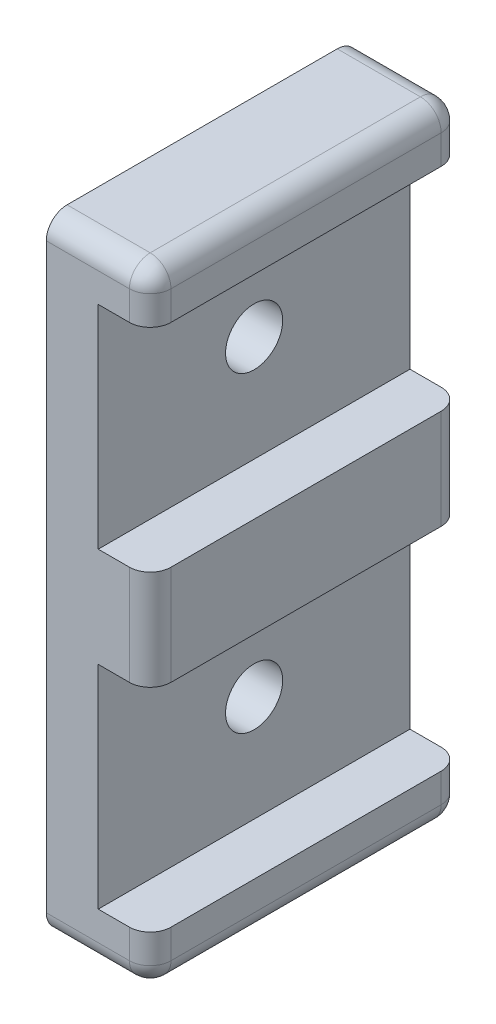
ISO-10303-21;
HEADER;
FILE_DESCRIPTION(('STEP AP214'),'2;1');
FILE_NAME('part.step','',(''),(''),'','','');
FILE_SCHEMA(('AUTOMOTIVE_DESIGN { 1 0 10303 214 1 1 1 1 }'));
ENDSEC;
DATA;
#1=APPLICATION_CONTEXT('core data for automotive mechanical design processes');
#2=APPLICATION_PROTOCOL_DEFINITION('international standard','automotive_design',2000,#1);
#3=PRODUCT_CONTEXT('',#1,'mechanical');
#4=PRODUCT('Part','Part','',(#3));
#5=PRODUCT_RELATED_PRODUCT_CATEGORY('part','',(#4));
#6=PRODUCT_DEFINITION_FORMATION('','',#4);
#7=PRODUCT_DEFINITION_CONTEXT('part definition',#1,'design');
#8=PRODUCT_DEFINITION('design','',#6,#7);
#9=PRODUCT_DEFINITION_SHAPE('','',#8);
#10=(LENGTH_UNIT() NAMED_UNIT(*) SI_UNIT(.MILLI.,.METRE.));
#11=(NAMED_UNIT(*) PLANE_ANGLE_UNIT() SI_UNIT($,.RADIAN.));
#12=(NAMED_UNIT(*) SI_UNIT($,.STERADIAN.) SOLID_ANGLE_UNIT());
#13=UNCERTAINTY_MEASURE_WITH_UNIT(LENGTH_MEASURE(1.E-05),#10,'distance_accuracy_value','');
#14=(GEOMETRIC_REPRESENTATION_CONTEXT(3) GLOBAL_UNCERTAINTY_ASSIGNED_CONTEXT((#13)) GLOBAL_UNIT_ASSIGNED_CONTEXT((#10,
#11,#12)) REPRESENTATION_CONTEXT('',''));
#15=CARTESIAN_POINT('',(0.,0.,0.));
#16=DIRECTION('',(0.,0.,1.));
#17=DIRECTION('',(1.,0.,0.));
#18=AXIS2_PLACEMENT_3D('',#15,#16,#17);
#19=CARTESIAN_POINT('',(0.,-28.0000000000014,12.9999999999988));
#20=DIRECTION('',(1.,0.,0.));
#21=DIRECTION('',(0.,0.,-1.));
#22=AXIS2_PLACEMENT_3D('',#19,#20,#21);
#23=PLANE('',#22);
#24=CARTESIAN_POINT('',(0.,14.9999999999986,-8.74300631892311E-13));
#25=DIRECTION('',(1.,0.,0.));
#26=DIRECTION('',(0.,0.,-1.));
#27=AXIS2_PLACEMENT_3D('',#24,#25,#26);
#28=CIRCLE('',#27,2.75);
#29=CARTESIAN_POINT('',(0.,14.9999999999986,-2.75000000000087));
#30=VERTEX_POINT('',#29);
#31=EDGE_CURVE('E217',#30,#30,#28,.T.);
#32=ORIENTED_EDGE('',*,*,#31,.F.);
#33=EDGE_LOOP('',(#32));
#34=FACE_BOUND('',#33,.T.);
#35=DIRECTION('',(0.,-1.,0.));
#36=VECTOR('',#35,1.);
#37=CARTESIAN_POINT('',(0.,27.9999999999987,14.9999999999988));
#38=LINE('',#37,#36);
#39=CARTESIAN_POINT('',(0.,25.2,14.9999999999988));
#40=VERTEX_POINT('',#39);
#41=CARTESIAN_POINT('',(0.,4.80000000000012,14.999999999999));
#42=VERTEX_POINT('',#41);
#43=EDGE_CURVE('E203',#40,#42,#38,.T.);
#44=ORIENTED_EDGE('',*,*,#43,.T.);
#45=DIRECTION('',(0.,0.,1.));
#46=VECTOR('',#45,1.);
#47=CARTESIAN_POINT('',(0.,4.80000000000012,0.));
#48=LINE('',#47,#46);
#49=CARTESIAN_POINT('',(0.,4.80000000000012,-15.0000000000007));
#50=VERTEX_POINT('',#49);
#51=EDGE_CURVE('E188',#50,#42,#48,.T.);
#52=ORIENTED_EDGE('',*,*,#51,.F.);
#53=DIRECTION('',(0.,1.,0.));
#54=VECTOR('',#53,1.);
#55=CARTESIAN_POINT('',(0.,-28.0000000000014,-15.0000000000006));
#56=LINE('',#55,#54);
#57=CARTESIAN_POINT('',(0.,25.2,-15.0000000000008));
#58=VERTEX_POINT('',#57);
#59=EDGE_CURVE('E200',#50,#58,#56,.T.);
#60=ORIENTED_EDGE('',*,*,#59,.T.);
#61=DIRECTION('',(0.,0.,-1.));
#62=VECTOR('',#61,1.);
#63=CARTESIAN_POINT('',(0.,25.2,0.));
#64=LINE('',#63,#62);
#65=EDGE_CURVE('E194',#40,#58,#64,.T.);
#66=ORIENTED_EDGE('',*,*,#65,.F.);
#67=EDGE_LOOP('',(#44,#52,#60,#66));
#68=FACE_BOUND('',#67,.T.);
#69=ADVANCED_FACE('F32',(#34,#68),#23,.T.);
#70=CARTESIAN_POINT('',(0.,-14.9999999999986,-8.70677814856241E-13));
#71=DIRECTION('',(1.,0.,0.));
#72=DIRECTION('',(0.,0.,-1.));
#73=AXIS2_PLACEMENT_3D('',#70,#71,#72);
#74=CIRCLE('',#73,2.75);
#75=CARTESIAN_POINT('',(0.,-14.9999999999986,-2.75000000000087));
#76=VERTEX_POINT('',#75);
#77=EDGE_CURVE('E352',#76,#76,#74,.T.);
#78=ORIENTED_EDGE('',*,*,#77,.F.);
#79=EDGE_LOOP('',(#78));
#80=FACE_BOUND('',#79,.T.);
#81=CARTESIAN_POINT('',(0.,-4.79999999999988,14.999999999999));
#82=VERTEX_POINT('',#81);
#83=CARTESIAN_POINT('',(0.,-25.1999999999999,14.9999999999991));
#84=VERTEX_POINT('',#83);
#85=EDGE_CURVE('E215',#82,#84,#38,.T.);
#86=ORIENTED_EDGE('',*,*,#85,.T.);
#87=DIRECTION('',(0.,0.,1.));
#88=VECTOR('',#87,1.);
#89=CARTESIAN_POINT('',(0.,-25.1999999999999,0.));
#90=LINE('',#89,#88);
#91=CARTESIAN_POINT('',(0.,-25.1999999999999,-15.0000000000006));
#92=VERTEX_POINT('',#91);
#93=EDGE_CURVE('E314',#92,#84,#90,.T.);
#94=ORIENTED_EDGE('',*,*,#93,.F.);
#95=CARTESIAN_POINT('',(0.,-4.79999999999989,-15.0000000000007));
#96=VERTEX_POINT('',#95);
#97=EDGE_CURVE('E211',#92,#96,#56,.T.);
#98=ORIENTED_EDGE('',*,*,#97,.T.);
#99=DIRECTION('',(0.,0.,-1.));
#100=VECTOR('',#99,1.);
#101=CARTESIAN_POINT('',(0.,-4.79999999999989,0.));
#102=LINE('',#101,#100);
#103=EDGE_CURVE('E204',#82,#96,#102,.T.);
#104=ORIENTED_EDGE('',*,*,#103,.F.);
#105=EDGE_LOOP('',(#86,#94,#98,#104));
#106=FACE_BOUND('',#105,.T.);
#107=ADVANCED_FACE('F437',(#80,#106),#23,.T.);
#108=CARTESIAN_POINT('',(-5.,-28.0000000000014,12.9999999999988));
#109=DIRECTION('',(1.,0.,0.));
#110=DIRECTION('',(0.,0.,-1.));
#111=AXIS2_PLACEMENT_3D('',#108,#109,#110);
#112=CYLINDRICAL_SURFACE('',#111,2.00000000000032);
#113=DIRECTION('',(1.,0.,0.));
#114=VECTOR('',#113,1.);
#115=CARTESIAN_POINT('',(-5.,-30.0000000000017,12.9999999999991));
#116=LINE('',#115,#114);
#117=CARTESIAN_POINT('',(-5.,-30.0000000000017,12.9999999999991));
#118=VERTEX_POINT('',#117);
#119=CARTESIAN_POINT('',(3.,-30.0000000000017,12.9999999999991));
#120=VERTEX_POINT('',#119);
#121=EDGE_CURVE('E246',#118,#120,#116,.T.);
#122=ORIENTED_EDGE('',*,*,#121,.T.);
#123=CARTESIAN_POINT('',(3.,-28.0000000000014,12.9999999999988));
#124=DIRECTION('',(1.,0.,0.));
#125=DIRECTION('',(0.,0.,-1.));
#126=AXIS2_PLACEMENT_3D('',#123,#124,#125);
#127=CIRCLE('',#126,2.00000000000032);
#128=CARTESIAN_POINT('',(3.,-28.0000000000014,14.9999999999991));
#129=VERTEX_POINT('',#128);
#130=EDGE_CURVE('E265',#120,#129,#127,.F.);
#131=ORIENTED_EDGE('',*,*,#130,.T.);
#132=DIRECTION('',(1.,0.,0.));
#133=VECTOR('',#132,1.);
#134=CARTESIAN_POINT('',(-5.,-28.0000000000014,14.9999999999991));
#135=LINE('',#134,#133);
#136=CARTESIAN_POINT('',(-5.,-28.0000000000014,14.9999999999991));
#137=VERTEX_POINT('',#136);
#138=EDGE_CURVE('E225',#137,#129,#135,.T.);
#139=ORIENTED_EDGE('',*,*,#138,.F.);
#140=CARTESIAN_POINT('',(-5.,-28.0000000000014,12.9999999999988));
#141=DIRECTION('',(1.,0.,0.));
#142=DIRECTION('',(0.,0.,-1.));
#143=AXIS2_PLACEMENT_3D('',#140,#141,#142);
#144=CIRCLE('',#143,2.00000000000032);
#145=EDGE_CURVE('E224',#137,#118,#144,.T.);
#146=ORIENTED_EDGE('',*,*,#145,.T.);
#147=EDGE_LOOP('',(#122,#131,#139,#146));
#148=FACE_BOUND('',#147,.T.);
#149=ADVANCED_FACE('F392',(#148),#112,.T.);
#150=CARTESIAN_POINT('',(-5.,27.9999999999987,14.9999999999988));
#151=DIRECTION('',(0.,0.,1.));
#152=DIRECTION('',(0.,-1.,0.));
#153=AXIS2_PLACEMENT_3D('',#150,#151,#152);
#154=PLANE('',#153);
#155=ORIENTED_EDGE('',*,*,#138,.T.);
#156=DIRECTION('',(0.,-1.,0.));
#157=VECTOR('',#156,1.);
#158=CARTESIAN_POINT('',(3.,27.9999999999987,14.9999999999988));
#159=LINE('',#158,#157);
#160=CARTESIAN_POINT('',(3.,-25.1999999999999,14.9999999999991));
#161=VERTEX_POINT('',#160);
#162=EDGE_CURVE('E259',#129,#161,#159,.F.);
#163=ORIENTED_EDGE('',*,*,#162,.T.);
#164=DIRECTION('',(-1.,0.,0.));
#165=VECTOR('',#164,1.);
#166=CARTESIAN_POINT('',(5.,-25.1999999999999,14.9999999999991));
#167=LINE('',#166,#165);
#168=EDGE_CURVE('E405',#161,#84,#167,.T.);
#169=ORIENTED_EDGE('',*,*,#168,.T.);
#170=ORIENTED_EDGE('',*,*,#85,.F.);
#171=DIRECTION('',(-1.,0.,0.));
#172=VECTOR('',#171,1.);
#173=CARTESIAN_POINT('',(5.,-4.79999999999989,14.999999999999));
#174=LINE('',#173,#172);
#175=CARTESIAN_POINT('',(3.,-4.79999999999989,14.999999999999));
#176=VERTEX_POINT('',#175);
#177=EDGE_CURVE('E428',#176,#82,#174,.T.);
#178=ORIENTED_EDGE('',*,*,#177,.F.);
#179=DIRECTION('',(0.,-1.,0.));
#180=VECTOR('',#179,1.);
#181=CARTESIAN_POINT('',(3.,27.9999999999987,14.9999999999988));
#182=LINE('',#181,#180);
#183=CARTESIAN_POINT('',(3.,4.80000000000012,14.999999999999));
#184=VERTEX_POINT('',#183);
#185=EDGE_CURVE('E257',#176,#184,#182,.F.);
#186=ORIENTED_EDGE('',*,*,#185,.T.);
#187=DIRECTION('',(-1.,0.,0.));
#188=VECTOR('',#187,1.);
#189=CARTESIAN_POINT('',(5.,4.80000000000012,14.999999999999));
#190=LINE('',#189,#188);
#191=EDGE_CURVE('E195',#184,#42,#190,.T.);
#192=ORIENTED_EDGE('',*,*,#191,.T.);
#193=ORIENTED_EDGE('',*,*,#43,.F.);
#194=DIRECTION('',(-1.,0.,0.));
#195=VECTOR('',#194,1.);
#196=CARTESIAN_POINT('',(5.,25.2,14.9999999999988));
#197=LINE('',#196,#195);
#198=CARTESIAN_POINT('',(3.,25.2,14.9999999999988));
#199=VERTEX_POINT('',#198);
#200=EDGE_CURVE('E346',#199,#40,#197,.T.);
#201=ORIENTED_EDGE('',*,*,#200,.F.);
#202=DIRECTION('',(0.,-1.,0.));
#203=VECTOR('',#202,1.);
#204=CARTESIAN_POINT('',(3.,27.9999999999987,14.9999999999988));
#205=LINE('',#204,#203);
#206=CARTESIAN_POINT('',(3.,27.9999999999987,14.9999999999988));
#207=VERTEX_POINT('',#206);
#208=EDGE_CURVE('E255',#199,#207,#205,.F.);
#209=ORIENTED_EDGE('',*,*,#208,.T.);
#210=DIRECTION('',(1.,0.,0.));
#211=VECTOR('',#210,1.);
#212=CARTESIAN_POINT('',(-5.,27.9999999999987,14.9999999999988));
#213=LINE('',#212,#211);
#214=CARTESIAN_POINT('',(-5.,27.9999999999987,14.9999999999988));
#215=VERTEX_POINT('',#214);
#216=EDGE_CURVE('E229',#215,#207,#213,.T.);
#217=ORIENTED_EDGE('',*,*,#216,.F.);
#218=DIRECTION('',(0.,-1.,0.));
#219=VECTOR('',#218,1.);
#220=CARTESIAN_POINT('',(-5.,27.9999999999987,14.9999999999988));
#221=LINE('',#220,#219);
#222=EDGE_CURVE('E221',#215,#137,#221,.T.);
#223=ORIENTED_EDGE('',*,*,#222,.T.);
#224=EDGE_LOOP('',(#155,#163,#169,#170,#178,#186,#192,#193,#201,#209,#217,#223));
#225=FACE_BOUND('',#224,.T.);
#226=ADVANCED_FACE('F383',(#225),#154,.T.);
#227=CARTESIAN_POINT('',(-5.,27.9999999999987,12.9999999999988));
#228=DIRECTION('',(1.,0.,0.));
#229=DIRECTION('',(0.,0.,-1.));
#230=AXIS2_PLACEMENT_3D('',#227,#228,#229);
#231=CYLINDRICAL_SURFACE('',#230,2.00000000000002);
#232=ORIENTED_EDGE('',*,*,#216,.T.);
#233=CARTESIAN_POINT('',(3.,27.9999999999987,12.9999999999988));
#234=DIRECTION('',(1.,0.,0.));
#235=DIRECTION('',(0.,0.,-1.));
#236=AXIS2_PLACEMENT_3D('',#233,#234,#235);
#237=CIRCLE('',#236,2.00000000000002);
#238=CARTESIAN_POINT('',(3.,29.9999999999987,12.9999999999991));
#239=VERTEX_POINT('',#238);
#240=EDGE_CURVE('E292',#207,#239,#237,.F.);
#241=ORIENTED_EDGE('',*,*,#240,.T.);
#242=DIRECTION('',(1.,0.,0.));
#243=VECTOR('',#242,1.);
#244=CARTESIAN_POINT('',(-5.,29.9999999999987,12.9999999999991));
#245=LINE('',#244,#243);
#246=CARTESIAN_POINT('',(-5.,29.9999999999987,12.9999999999991));
#247=VERTEX_POINT('',#246);
#248=EDGE_CURVE('E232',#247,#239,#245,.T.);
#249=ORIENTED_EDGE('',*,*,#248,.F.);
#250=CARTESIAN_POINT('',(-5.,27.9999999999987,12.9999999999988));
#251=DIRECTION('',(1.,0.,0.));
#252=DIRECTION('',(0.,0.,-1.));
#253=AXIS2_PLACEMENT_3D('',#250,#251,#252);
#254=CIRCLE('',#253,2.00000000000002);
#255=EDGE_CURVE('E376',#247,#215,#254,.T.);
#256=ORIENTED_EDGE('',*,*,#255,.T.);
#257=EDGE_LOOP('',(#232,#241,#249,#256));
#258=FACE_BOUND('',#257,.T.);
#259=ADVANCED_FACE('F464',(#258),#231,.T.);
#260=CARTESIAN_POINT('',(-5.,29.999999999999,-13.0000000000009));
#261=DIRECTION('',(0.,1.,0.));
#262=DIRECTION('',(0.,0.,1.));
#263=AXIS2_PLACEMENT_3D('',#260,#261,#262);
#264=PLANE('',#263);
#265=ORIENTED_EDGE('',*,*,#248,.T.);
#266=DIRECTION('',(0.,0.,1.));
#267=VECTOR('',#266,1.);
#268=CARTESIAN_POINT('',(3.,29.999999999999,-13.0000000000009));
#269=LINE('',#268,#267);
#270=CARTESIAN_POINT('',(3.,29.999999999999,-13.0000000000009));
#271=VERTEX_POINT('',#270);
#272=EDGE_CURVE('E290',#239,#271,#269,.F.);
#273=ORIENTED_EDGE('',*,*,#272,.T.);
#274=DIRECTION('',(1.,0.,0.));
#275=VECTOR('',#274,1.);
#276=CARTESIAN_POINT('',(-5.,29.999999999999,-13.0000000000009));
#277=LINE('',#276,#275);
#278=CARTESIAN_POINT('',(-5.,29.999999999999,-13.0000000000009));
#279=VERTEX_POINT('',#278);
#280=EDGE_CURVE('E235',#279,#271,#277,.T.);
#281=ORIENTED_EDGE('',*,*,#280,.F.);
#282=DIRECTION('',(0.,0.,1.));
#283=VECTOR('',#282,1.);
#284=CARTESIAN_POINT('',(-5.,29.999999999999,-13.0000000000009));
#285=LINE('',#284,#283);
#286=EDGE_CURVE('E374',#279,#247,#285,.T.);
#287=ORIENTED_EDGE('',*,*,#286,.T.);
#288=EDGE_LOOP('',(#265,#273,#281,#287));
#289=FACE_BOUND('',#288,.T.);
#290=ADVANCED_FACE('F467',(#289),#264,.T.);
#291=CARTESIAN_POINT('',(-5.,27.9999999999987,-13.0000000000006));
#292=DIRECTION('',(1.,0.,0.));
#293=DIRECTION('',(0.,0.,-1.));
#294=AXIS2_PLACEMENT_3D('',#291,#292,#293);
#295=CYLINDRICAL_SURFACE('',#294,2.00000000000027);
#296=ORIENTED_EDGE('',*,*,#280,.T.);
#297=CARTESIAN_POINT('',(3.,27.9999999999987,-13.0000000000006));
#298=DIRECTION('',(1.,0.,0.));
#299=DIRECTION('',(0.,0.,-1.));
#300=AXIS2_PLACEMENT_3D('',#297,#298,#299);
#301=CIRCLE('',#300,2.00000000000027);
#302=CARTESIAN_POINT('',(3.,27.9999999999987,-15.0000000000008));
#303=VERTEX_POINT('',#302);
#304=EDGE_CURVE('E288',#271,#303,#301,.F.);
#305=ORIENTED_EDGE('',*,*,#304,.T.);
#306=DIRECTION('',(1.,0.,0.));
#307=VECTOR('',#306,1.);
#308=CARTESIAN_POINT('',(-5.,27.9999999999987,-15.0000000000008));
#309=LINE('',#308,#307);
#310=CARTESIAN_POINT('',(-5.,27.9999999999987,-15.0000000000008));
#311=VERTEX_POINT('',#310);
#312=EDGE_CURVE('E238',#311,#303,#309,.T.);
#313=ORIENTED_EDGE('',*,*,#312,.F.);
#314=CARTESIAN_POINT('',(-5.,27.9999999999987,-13.0000000000006));
#315=DIRECTION('',(1.,0.,0.));
#316=DIRECTION('',(0.,0.,-1.));
#317=AXIS2_PLACEMENT_3D('',#314,#315,#316);
#318=CIRCLE('',#317,2.00000000000027);
#319=EDGE_CURVE('E371',#311,#279,#318,.T.);
#320=ORIENTED_EDGE('',*,*,#319,.T.);
#321=EDGE_LOOP('',(#296,#305,#313,#320));
#322=FACE_BOUND('',#321,.T.);
#323=ADVANCED_FACE('F470',(#322),#295,.T.);
#324=CARTESIAN_POINT('',(-5.,-28.0000000000014,-15.0000000000006));
#325=DIRECTION('',(0.,0.,-1.));
#326=DIRECTION('',(0.,1.,0.));
#327=AXIS2_PLACEMENT_3D('',#324,#325,#326);
#328=PLANE('',#327);
#329=ORIENTED_EDGE('',*,*,#312,.T.);
#330=DIRECTION('',(0.,1.,0.));
#331=VECTOR('',#330,1.);
#332=CARTESIAN_POINT('',(3.,-28.0000000000014,-15.0000000000006));
#333=LINE('',#332,#331);
#334=CARTESIAN_POINT('',(3.,25.2,-15.0000000000008));
#335=VERTEX_POINT('',#334);
#336=EDGE_CURVE('E282',#303,#335,#333,.F.);
#337=ORIENTED_EDGE('',*,*,#336,.T.);
#338=DIRECTION('',(-1.,0.,0.));
#339=VECTOR('',#338,1.);
#340=CARTESIAN_POINT('',(5.,25.2,-15.0000000000008));
#341=LINE('',#340,#339);
#342=EDGE_CURVE('E210',#335,#58,#341,.T.);
#343=ORIENTED_EDGE('',*,*,#342,.T.);
#344=ORIENTED_EDGE('',*,*,#59,.F.);
#345=DIRECTION('',(-1.,0.,0.));
#346=VECTOR('',#345,1.);
#347=CARTESIAN_POINT('',(5.,4.80000000000012,-15.0000000000007));
#348=LINE('',#347,#346);
#349=CARTESIAN_POINT('',(3.,4.80000000000012,-15.0000000000007));
#350=VERTEX_POINT('',#349);
#351=EDGE_CURVE('E183',#350,#50,#348,.T.);
#352=ORIENTED_EDGE('',*,*,#351,.F.);
#353=DIRECTION('',(0.,1.,0.));
#354=VECTOR('',#353,1.);
#355=CARTESIAN_POINT('',(3.,-28.0000000000014,-15.0000000000006));
#356=LINE('',#355,#354);
#357=CARTESIAN_POINT('',(3.,-4.79999999999989,-15.0000000000007));
#358=VERTEX_POINT('',#357);
#359=EDGE_CURVE('E278',#350,#358,#356,.F.);
#360=ORIENTED_EDGE('',*,*,#359,.T.);
#361=DIRECTION('',(-1.,0.,0.));
#362=VECTOR('',#361,1.);
#363=CARTESIAN_POINT('',(5.,-4.79999999999989,-15.0000000000007));
#364=LINE('',#363,#362);
#365=EDGE_CURVE('E423',#358,#96,#364,.T.);
#366=ORIENTED_EDGE('',*,*,#365,.T.);
#367=ORIENTED_EDGE('',*,*,#97,.F.);
#368=DIRECTION('',(-1.,0.,0.));
#369=VECTOR('',#368,1.);
#370=CARTESIAN_POINT('',(5.,-25.1999999999999,-15.0000000000006));
#371=LINE('',#370,#369);
#372=CARTESIAN_POINT('',(3.,-25.1999999999999,-15.0000000000006));
#373=VERTEX_POINT('',#372);
#374=EDGE_CURVE('E205',#373,#92,#371,.T.);
#375=ORIENTED_EDGE('',*,*,#374,.F.);
#376=DIRECTION('',(0.,1.,0.));
#377=VECTOR('',#376,1.);
#378=CARTESIAN_POINT('',(3.,-28.0000000000014,-15.0000000000006));
#379=LINE('',#378,#377);
#380=CARTESIAN_POINT('',(3.,-28.0000000000014,-15.0000000000006));
#381=VERTEX_POINT('',#380);
#382=EDGE_CURVE('E280',#373,#381,#379,.F.);
#383=ORIENTED_EDGE('',*,*,#382,.T.);
#384=DIRECTION('',(1.,0.,0.));
#385=VECTOR('',#384,1.);
#386=CARTESIAN_POINT('',(-5.,-28.0000000000014,-15.0000000000006));
#387=LINE('',#386,#385);
#388=CARTESIAN_POINT('',(-5.,-28.0000000000014,-15.0000000000006));
#389=VERTEX_POINT('',#388);
#390=EDGE_CURVE('E240',#389,#381,#387,.T.);
#391=ORIENTED_EDGE('',*,*,#390,.F.);
#392=DIRECTION('',(0.,1.,0.));
#393=VECTOR('',#392,1.);
#394=CARTESIAN_POINT('',(-5.,-28.0000000000014,-15.0000000000006));
#395=LINE('',#394,#393);
#396=EDGE_CURVE('E368',#389,#311,#395,.T.);
#397=ORIENTED_EDGE('',*,*,#396,.T.);
#398=EDGE_LOOP('',(#329,#337,#343,#344,#352,#360,#366,#367,#375,#383,#391,#397));
#399=FACE_BOUND('',#398,.T.);
#400=ADVANCED_FACE('F208',(#399),#328,.T.);
#401=CARTESIAN_POINT('',(-5.,-28.0000000000014,-13.0000000000006));
#402=DIRECTION('',(1.,0.,0.));
#403=DIRECTION('',(0.,0.,-1.));
#404=AXIS2_PLACEMENT_3D('',#401,#402,#403);
#405=CYLINDRICAL_SURFACE('',#404,2.00000000000002);
#406=ORIENTED_EDGE('',*,*,#390,.T.);
#407=CARTESIAN_POINT('',(3.,-28.0000000000014,-13.0000000000006));
#408=DIRECTION('',(1.,0.,0.));
#409=DIRECTION('',(0.,0.,-1.));
#410=AXIS2_PLACEMENT_3D('',#407,#408,#409);
#411=CIRCLE('',#410,2.00000000000002);
#412=CARTESIAN_POINT('',(3.,-30.0000000000014,-13.0000000000009));
#413=VERTEX_POINT('',#412);
#414=EDGE_CURVE('E269',#381,#413,#411,.F.);
#415=ORIENTED_EDGE('',*,*,#414,.T.);
#416=DIRECTION('',(1.,0.,0.));
#417=VECTOR('',#416,1.);
#418=CARTESIAN_POINT('',(-5.,-30.0000000000014,-13.0000000000009));
#419=LINE('',#418,#417);
#420=CARTESIAN_POINT('',(-5.,-30.0000000000014,-13.0000000000009));
#421=VERTEX_POINT('',#420);
#422=EDGE_CURVE('E243',#421,#413,#419,.T.);
#423=ORIENTED_EDGE('',*,*,#422,.F.);
#424=CARTESIAN_POINT('',(-5.,-28.0000000000014,-13.0000000000006));
#425=DIRECTION('',(1.,0.,0.));
#426=DIRECTION('',(0.,0.,-1.));
#427=AXIS2_PLACEMENT_3D('',#424,#425,#426);
#428=CIRCLE('',#427,2.00000000000002);
#429=EDGE_CURVE('E365',#421,#389,#428,.T.);
#430=ORIENTED_EDGE('',*,*,#429,.T.);
#431=EDGE_LOOP('',(#406,#415,#423,#430));
#432=FACE_BOUND('',#431,.T.);
#433=ADVANCED_FACE('F477',(#432),#405,.T.);
#434=CARTESIAN_POINT('',(-5.,-30.0000000000017,12.9999999999991));
#435=DIRECTION('',(0.,-1.,0.));
#436=DIRECTION('',(0.,0.,-1.));
#437=AXIS2_PLACEMENT_3D('',#434,#435,#436);
#438=PLANE('',#437);
#439=ORIENTED_EDGE('',*,*,#422,.T.);
#440=DIRECTION('',(0.,0.,-1.));
#441=VECTOR('',#440,1.);
#442=CARTESIAN_POINT('',(3.,-30.0000000000017,12.9999999999991));
#443=LINE('',#442,#441);
#444=EDGE_CURVE('E267',#413,#120,#443,.F.);
#445=ORIENTED_EDGE('',*,*,#444,.T.);
#446=ORIENTED_EDGE('',*,*,#121,.F.);
#447=DIRECTION('',(0.,0.,-1.));
#448=VECTOR('',#447,1.);
#449=CARTESIAN_POINT('',(-5.,-30.0000000000017,12.9999999999991));
#450=LINE('',#449,#448);
#451=EDGE_CURVE('E362',#118,#421,#450,.T.);
#452=ORIENTED_EDGE('',*,*,#451,.T.);
#453=EDGE_LOOP('',(#439,#445,#446,#452));
#454=FACE_BOUND('',#453,.T.);
#455=ADVANCED_FACE('F480',(#454),#438,.T.);
#456=CARTESIAN_POINT('',(-5.,-28.0000000000014,12.9999999999988));
#457=DIRECTION('',(1.,0.,0.));
#458=DIRECTION('',(0.,0.,-1.));
#459=AXIS2_PLACEMENT_3D('',#456,#457,#458);
#460=PLANE('',#459);
#461=CARTESIAN_POINT('',(-5.,-14.9999999999986,-8.70677814856241E-13));
#462=DIRECTION('',(1.,0.,0.));
#463=DIRECTION('',(0.,0.,-1.));
#464=AXIS2_PLACEMENT_3D('',#461,#462,#463);
#465=CIRCLE('',#464,2.75);
#466=CARTESIAN_POINT('',(-5.,-14.9999999999986,-2.75000000000087));
#467=VERTEX_POINT('',#466);
#468=EDGE_CURVE('E353',#467,#467,#465,.T.);
#469=ORIENTED_EDGE('',*,*,#468,.T.);
#470=EDGE_LOOP('',(#469));
#471=FACE_BOUND('',#470,.T.);
#472=CARTESIAN_POINT('',(-5.,14.9999999999986,-8.74300631892311E-13));
#473=DIRECTION('',(1.,0.,0.));
#474=DIRECTION('',(0.,0.,-1.));
#475=AXIS2_PLACEMENT_3D('',#472,#473,#474);
#476=CIRCLE('',#475,2.75);
#477=CARTESIAN_POINT('',(-5.,14.9999999999986,-2.75000000000087));
#478=VERTEX_POINT('',#477);
#479=EDGE_CURVE('E212',#478,#478,#476,.T.);
#480=ORIENTED_EDGE('',*,*,#479,.T.);
#481=EDGE_LOOP('',(#480));
#482=FACE_BOUND('',#481,.T.);
#483=ORIENTED_EDGE('',*,*,#145,.F.);
#484=ORIENTED_EDGE('',*,*,#222,.F.);
#485=ORIENTED_EDGE('',*,*,#255,.F.);
#486=ORIENTED_EDGE('',*,*,#286,.F.);
#487=ORIENTED_EDGE('',*,*,#319,.F.);
#488=ORIENTED_EDGE('',*,*,#396,.F.);
#489=ORIENTED_EDGE('',*,*,#429,.F.);
#490=ORIENTED_EDGE('',*,*,#451,.F.);
#491=EDGE_LOOP('',(#483,#484,#485,#486,#487,#488,#489,#490));
#492=FACE_BOUND('',#491,.T.);
#493=ADVANCED_FACE('F387',(#471,#482,#492),#460,.F.);
#494=CARTESIAN_POINT('',(-5.,14.9999999999986,-8.74300631892311E-13));
#495=DIRECTION('',(1.,0.,0.));
#496=DIRECTION('',(0.,0.,-1.));
#497=AXIS2_PLACEMENT_3D('',#494,#495,#496);
#498=CYLINDRICAL_SURFACE('',#497,2.75);
#499=ORIENTED_EDGE('',*,*,#479,.F.);
#500=EDGE_LOOP('',(#499));
#501=FACE_BOUND('',#500,.T.);
#502=ORIENTED_EDGE('',*,*,#31,.T.);
#503=EDGE_LOOP('',(#502));
#504=FACE_BOUND('',#503,.T.);
#505=ADVANCED_FACE('F708',(#501,#504),#498,.F.);
#506=CARTESIAN_POINT('',(-5.,-14.9999999999986,-8.70677814856241E-13));
#507=DIRECTION('',(1.,0.,0.));
#508=DIRECTION('',(0.,0.,-1.));
#509=AXIS2_PLACEMENT_3D('',#506,#507,#508);
#510=CYLINDRICAL_SURFACE('',#509,2.75);
#511=ORIENTED_EDGE('',*,*,#468,.F.);
#512=EDGE_LOOP('',(#511));
#513=FACE_BOUND('',#512,.T.);
#514=ORIENTED_EDGE('',*,*,#77,.T.);
#515=EDGE_LOOP('',(#514));
#516=FACE_BOUND('',#515,.T.);
#517=ADVANCED_FACE('F627',(#513,#516),#510,.F.);
#518=CARTESIAN_POINT('',(5.,25.2,0.));
#519=DIRECTION('',(0.,1.,0.));
#520=DIRECTION('',(0.,0.,1.));
#521=AXIS2_PLACEMENT_3D('',#518,#519,#520);
#522=PLANE('',#521);
#523=ORIENTED_EDGE('',*,*,#342,.F.);
#524=CARTESIAN_POINT('',(3.,25.2,-13.0000000000008));
#525=DIRECTION('',(0.,1.,0.));
#526=DIRECTION('',(0.,0.,1.));
#527=AXIS2_PLACEMENT_3D('',#524,#525,#526);
#528=CIRCLE('',#527,2.);
#529=CARTESIAN_POINT('',(5.,25.2,-13.0000000000008));
#530=VERTEX_POINT('',#529);
#531=EDGE_CURVE('E286',#335,#530,#528,.F.);
#532=ORIENTED_EDGE('',*,*,#531,.T.);
#533=DIRECTION('',(0.,0.,-1.));
#534=VECTOR('',#533,1.);
#535=CARTESIAN_POINT('',(5.,25.2,0.));
#536=LINE('',#535,#534);
#537=CARTESIAN_POINT('',(5.,25.2,12.9999999999988));
#538=VERTEX_POINT('',#537);
#539=EDGE_CURVE('E339',#538,#530,#536,.T.);
#540=ORIENTED_EDGE('',*,*,#539,.F.);
#541=CARTESIAN_POINT('',(3.,25.2,12.9999999999988));
#542=DIRECTION('',(0.,1.,0.));
#543=DIRECTION('',(0.,0.,1.));
#544=AXIS2_PLACEMENT_3D('',#541,#542,#543);
#545=CIRCLE('',#544,2.);
#546=EDGE_CURVE('E284',#538,#199,#545,.F.);
#547=ORIENTED_EDGE('',*,*,#546,.T.);
#548=ORIENTED_EDGE('',*,*,#200,.T.);
#549=ORIENTED_EDGE('',*,*,#65,.T.);
#550=EDGE_LOOP('',(#523,#532,#540,#547,#548,#549));
#551=FACE_BOUND('',#550,.T.);
#552=ADVANCED_FACE('F342',(#551),#522,.F.);
#553=CARTESIAN_POINT('',(5.,0.,0.));
#554=DIRECTION('',(1.,0.,0.));
#555=DIRECTION('',(0.,0.,-1.));
#556=AXIS2_PLACEMENT_3D('',#553,#554,#555);
#557=PLANE('',#556);
#558=ORIENTED_EDGE('',*,*,#539,.T.);
#559=DIRECTION('',(0.,1.,0.));
#560=VECTOR('',#559,1.);
#561=CARTESIAN_POINT('',(5.,0.,-13.0000000000007));
#562=LINE('',#561,#560);
#563=CARTESIAN_POINT('',(5.,27.999999999999,-13.0000000000006));
#564=VERTEX_POINT('',#563);
#565=EDGE_CURVE('E275',#530,#564,#562,.T.);
#566=ORIENTED_EDGE('',*,*,#565,.T.);
#567=DIRECTION('',(0.,0.,1.));
#568=VECTOR('',#567,1.);
#569=CARTESIAN_POINT('',(5.,27.9999999999988,2.69015579043777E-13));
#570=LINE('',#569,#568);
#571=CARTESIAN_POINT('',(5.,27.9999999999987,12.9999999999988));
#572=VERTEX_POINT('',#571);
#573=EDGE_CURVE('E273',#564,#572,#570,.T.);
#574=ORIENTED_EDGE('',*,*,#573,.T.);
#575=DIRECTION('',(0.,-1.,0.));
#576=VECTOR('',#575,1.);
#577=CARTESIAN_POINT('',(5.,0.,12.999999999999));
#578=LINE('',#577,#576);
#579=EDGE_CURVE('E271',#572,#538,#578,.T.);
#580=ORIENTED_EDGE('',*,*,#579,.T.);
#581=EDGE_LOOP('',(#558,#566,#574,#580));
#582=FACE_BOUND('',#581,.T.);
#583=ADVANCED_FACE('F338',(#582),#557,.T.);
#584=CARTESIAN_POINT('',(5.,4.80000000000012,0.));
#585=DIRECTION('',(0.,-1.,0.));
#586=DIRECTION('',(0.,0.,-1.));
#587=AXIS2_PLACEMENT_3D('',#584,#585,#586);
#588=PLANE('',#587);
#589=DIRECTION('',(0.,0.,1.));
#590=VECTOR('',#589,1.);
#591=CARTESIAN_POINT('',(5.,4.80000000000012,0.));
#592=LINE('',#591,#590);
#593=CARTESIAN_POINT('',(5.,4.80000000000012,-13.0000000000007));
#594=VERTEX_POINT('',#593);
#595=CARTESIAN_POINT('',(5.,4.80000000000012,12.999999999999));
#596=VERTEX_POINT('',#595);
#597=EDGE_CURVE('E419',#594,#596,#592,.T.);
#598=ORIENTED_EDGE('',*,*,#597,.F.);
#599=CARTESIAN_POINT('',(3.,4.80000000000012,-13.0000000000007));
#600=DIRECTION('',(0.,-1.,0.));
#601=DIRECTION('',(0.,0.,-1.));
#602=AXIS2_PLACEMENT_3D('',#599,#600,#601);
#603=CIRCLE('',#602,2.);
#604=EDGE_CURVE('E190',#594,#350,#603,.F.);
#605=ORIENTED_EDGE('',*,*,#604,.T.);
#606=ORIENTED_EDGE('',*,*,#351,.T.);
#607=ORIENTED_EDGE('',*,*,#51,.T.);
#608=ORIENTED_EDGE('',*,*,#191,.F.);
#609=CARTESIAN_POINT('',(3.,4.80000000000012,12.999999999999));
#610=DIRECTION('',(0.,-1.,0.));
#611=DIRECTION('',(0.,0.,-1.));
#612=AXIS2_PLACEMENT_3D('',#609,#610,#611);
#613=CIRCLE('',#612,2.);
#614=EDGE_CURVE('E299',#184,#596,#613,.F.);
#615=ORIENTED_EDGE('',*,*,#614,.T.);
#616=EDGE_LOOP('',(#598,#605,#606,#607,#608,#615));
#617=FACE_BOUND('',#616,.T.);
#618=ADVANCED_FACE('F186',(#617),#588,.F.);
#619=CARTESIAN_POINT('',(5.,-4.79999999999989,0.));
#620=DIRECTION('',(0.,1.,0.));
#621=DIRECTION('',(0.,0.,1.));
#622=AXIS2_PLACEMENT_3D('',#619,#620,#621);
#623=PLANE('',#622);
#624=ORIENTED_EDGE('',*,*,#365,.F.);
#625=CARTESIAN_POINT('',(3.,-4.79999999999989,-13.0000000000007));
#626=DIRECTION('',(0.,1.,0.));
#627=DIRECTION('',(0.,0.,1.));
#628=AXIS2_PLACEMENT_3D('',#625,#626,#627);
#629=CIRCLE('',#628,2.);
#630=CARTESIAN_POINT('',(5.,-4.79999999999989,-13.0000000000007));
#631=VERTEX_POINT('',#630);
#632=EDGE_CURVE('E11',#358,#631,#629,.F.);
#633=ORIENTED_EDGE('',*,*,#632,.T.);
#634=DIRECTION('',(0.,0.,-1.));
#635=VECTOR('',#634,1.);
#636=CARTESIAN_POINT('',(5.,-4.79999999999989,0.));
#637=LINE('',#636,#635);
#638=CARTESIAN_POINT('',(5.,-4.79999999999989,12.999999999999));
#639=VERTEX_POINT('',#638);
#640=EDGE_CURVE('E422',#639,#631,#637,.T.);
#641=ORIENTED_EDGE('',*,*,#640,.F.);
#642=CARTESIAN_POINT('',(3.,-4.79999999999989,12.999999999999));
#643=DIRECTION('',(0.,1.,0.));
#644=DIRECTION('',(0.,0.,1.));
#645=AXIS2_PLACEMENT_3D('',#642,#643,#644);
#646=CIRCLE('',#645,2.);
#647=EDGE_CURVE('E41',#639,#176,#646,.F.);
#648=ORIENTED_EDGE('',*,*,#647,.T.);
#649=ORIENTED_EDGE('',*,*,#177,.T.);
#650=ORIENTED_EDGE('',*,*,#103,.T.);
#651=EDGE_LOOP('',(#624,#633,#641,#648,#649,#650));
#652=FACE_BOUND('',#651,.T.);
#653=ADVANCED_FACE('F434',(#652),#623,.F.);
#654=CARTESIAN_POINT('',(5.,0.,0.));
#655=DIRECTION('',(1.,0.,0.));
#656=DIRECTION('',(0.,0.,-1.));
#657=AXIS2_PLACEMENT_3D('',#654,#655,#656);
#658=PLANE('',#657);
#659=ORIENTED_EDGE('',*,*,#640,.T.);
#660=DIRECTION('',(0.,1.,0.));
#661=VECTOR('',#660,1.);
#662=CARTESIAN_POINT('',(5.,0.,-13.0000000000007));
#663=LINE('',#662,#661);
#664=EDGE_CURVE('E296',#631,#594,#663,.T.);
#665=ORIENTED_EDGE('',*,*,#664,.T.);
#666=ORIENTED_EDGE('',*,*,#597,.T.);
#667=DIRECTION('',(0.,-1.,0.));
#668=VECTOR('',#667,1.);
#669=CARTESIAN_POINT('',(5.,0.,12.999999999999));
#670=LINE('',#669,#668);
#671=EDGE_CURVE('E294',#596,#639,#670,.T.);
#672=ORIENTED_EDGE('',*,*,#671,.T.);
#673=EDGE_LOOP('',(#659,#665,#666,#672));
#674=FACE_BOUND('',#673,.T.);
#675=ADVANCED_FACE('F432',(#674),#658,.T.);
#676=CARTESIAN_POINT('',(5.,-25.1999999999999,0.));
#677=DIRECTION('',(0.,-1.,0.));
#678=DIRECTION('',(0.,0.,-1.));
#679=AXIS2_PLACEMENT_3D('',#676,#677,#678);
#680=PLANE('',#679);
#681=ORIENTED_EDGE('',*,*,#168,.F.);
#682=CARTESIAN_POINT('',(3.,-25.1999999999999,12.9999999999991));
#683=DIRECTION('',(0.,-1.,0.));
#684=DIRECTION('',(0.,0.,-1.));
#685=AXIS2_PLACEMENT_3D('',#682,#683,#684);
#686=CIRCLE('',#685,2.);
#687=CARTESIAN_POINT('',(5.,-25.1999999999999,12.9999999999991));
#688=VERTEX_POINT('',#687);
#689=EDGE_CURVE('E263',#161,#688,#686,.F.);
#690=ORIENTED_EDGE('',*,*,#689,.T.);
#691=DIRECTION('',(0.,0.,1.));
#692=VECTOR('',#691,1.);
#693=CARTESIAN_POINT('',(5.,-25.1999999999999,0.));
#694=LINE('',#693,#692);
#695=CARTESIAN_POINT('',(5.,-25.1999999999999,-13.0000000000006));
#696=VERTEX_POINT('',#695);
#697=EDGE_CURVE('E413',#696,#688,#694,.T.);
#698=ORIENTED_EDGE('',*,*,#697,.F.);
#699=CARTESIAN_POINT('',(3.,-25.1999999999999,-13.0000000000006));
#700=DIRECTION('',(0.,-1.,0.));
#701=DIRECTION('',(0.,0.,-1.));
#702=AXIS2_PLACEMENT_3D('',#699,#700,#701);
#703=CIRCLE('',#702,2.);
#704=EDGE_CURVE('E261',#696,#373,#703,.F.);
#705=ORIENTED_EDGE('',*,*,#704,.T.);
#706=ORIENTED_EDGE('',*,*,#374,.T.);
#707=ORIENTED_EDGE('',*,*,#93,.T.);
#708=EDGE_LOOP('',(#681,#690,#698,#705,#706,#707));
#709=FACE_BOUND('',#708,.T.);
#710=ADVANCED_FACE('F409',(#709),#680,.F.);
#711=CARTESIAN_POINT('',(5.,0.,0.));
#712=DIRECTION('',(1.,0.,0.));
#713=DIRECTION('',(0.,0.,-1.));
#714=AXIS2_PLACEMENT_3D('',#711,#712,#713);
#715=PLANE('',#714);
#716=ORIENTED_EDGE('',*,*,#697,.T.);
#717=DIRECTION('',(0.,-1.,0.));
#718=VECTOR('',#717,1.);
#719=CARTESIAN_POINT('',(5.,0.,12.999999999999));
#720=LINE('',#719,#718);
#721=CARTESIAN_POINT('',(5.,-28.0000000000017,12.9999999999988));
#722=VERTEX_POINT('',#721);
#723=EDGE_CURVE('E252',#688,#722,#720,.T.);
#724=ORIENTED_EDGE('',*,*,#723,.T.);
#725=DIRECTION('',(0.,0.,-1.));
#726=VECTOR('',#725,1.);
#727=CARTESIAN_POINT('',(5.,-28.0000000000015,-3.28796818831314E-13));
#728=LINE('',#727,#726);
#729=CARTESIAN_POINT('',(5.,-28.0000000000014,-13.0000000000006));
#730=VERTEX_POINT('',#729);
#731=EDGE_CURVE('E250',#722,#730,#728,.T.);
#732=ORIENTED_EDGE('',*,*,#731,.T.);
#733=DIRECTION('',(0.,1.,0.));
#734=VECTOR('',#733,1.);
#735=CARTESIAN_POINT('',(5.,0.,-13.0000000000007));
#736=LINE('',#735,#734);
#737=EDGE_CURVE('E228',#730,#696,#736,.T.);
#738=ORIENTED_EDGE('',*,*,#737,.T.);
#739=EDGE_LOOP('',(#716,#724,#732,#738));
#740=FACE_BOUND('',#739,.T.);
#741=ADVANCED_FACE('F501',(#740),#715,.T.);
#742=CARTESIAN_POINT('',(3.,0.,-13.0000000000007));
#743=DIRECTION('',(0.,1.,0.));
#744=DIRECTION('',(0.,0.,1.));
#745=AXIS2_PLACEMENT_3D('',#742,#743,#744);
#746=CYLINDRICAL_SURFACE('',#745,2.);
#747=CARTESIAN_POINT('',(3.,-28.0000000000013,-13.0000000000006));
#748=DIRECTION('',(0.,-1.,0.));
#749=DIRECTION('',(0.,0.,-1.));
#750=AXIS2_PLACEMENT_3D('',#747,#748,#749);
#751=CIRCLE('',#750,2.);
#752=EDGE_CURVE('E311',#381,#730,#751,.T.);
#753=ORIENTED_EDGE('',*,*,#752,.F.);
#754=ORIENTED_EDGE('',*,*,#382,.F.);
#755=ORIENTED_EDGE('',*,*,#704,.F.);
#756=ORIENTED_EDGE('',*,*,#737,.F.);
#757=EDGE_LOOP('',(#753,#754,#755,#756));
#758=FACE_BOUND('',#757,.T.);
#759=ADVANCED_FACE('F498',(#758),#746,.T.);
#760=CARTESIAN_POINT('',(3.,-28.0000000000014,-13.0000000000006));
#761=DIRECTION('',(1.,0.,0.));
#762=DIRECTION('',(0.,0.,-1.));
#763=AXIS2_PLACEMENT_3D('',#760,#761,#762);
#764=SPHERICAL_SURFACE('',#763,2.);
#765=ORIENTED_EDGE('',*,*,#414,.F.);
#766=ORIENTED_EDGE('',*,*,#752,.T.);
#767=CARTESIAN_POINT('',(3.,-28.0000000000014,-13.0000000000006));
#768=DIRECTION('',(0.,-1.52655665885959E-13,1.));
#769=DIRECTION('',(0.,-1.,-1.52655665885959E-13));
#770=AXIS2_PLACEMENT_3D('',#767,#768,#769);
#771=CIRCLE('',#770,2.);
#772=EDGE_CURVE('E308',#413,#730,#771,.T.);
#773=ORIENTED_EDGE('',*,*,#772,.F.);
#774=EDGE_LOOP('',(#765,#766,#773));
#775=FACE_BOUND('',#774,.T.);
#776=ADVANCED_FACE('F494',(#775),#764,.T.);
#777=CARTESIAN_POINT('',(3.,-28.0000000000015,-3.28796818831314E-13));
#778=DIRECTION('',(0.,0.,-1.));
#779=DIRECTION('',(0.,1.,0.));
#780=AXIS2_PLACEMENT_3D('',#777,#778,#779);
#781=CYLINDRICAL_SURFACE('',#780,2.);
#782=CARTESIAN_POINT('',(3.,-28.0000000000017,12.9999999999991));
#783=DIRECTION('',(1.64798730217797E-13,0.,1.));
#784=DIRECTION('',(1.,0.,-1.64798730217797E-13));
#785=AXIS2_PLACEMENT_3D('',#782,#783,#784);
#786=CIRCLE('',#785,2.);
#787=EDGE_CURVE('E305',#120,#722,#786,.T.);
#788=ORIENTED_EDGE('',*,*,#787,.F.);
#789=ORIENTED_EDGE('',*,*,#444,.F.);
#790=ORIENTED_EDGE('',*,*,#772,.T.);
#791=ORIENTED_EDGE('',*,*,#731,.F.);
#792=EDGE_LOOP('',(#788,#789,#790,#791));
#793=FACE_BOUND('',#792,.T.);
#794=ADVANCED_FACE('F491',(#793),#781,.T.);
#795=CARTESIAN_POINT('',(3.,-28.0000000000014,12.9999999999988));
#796=DIRECTION('',(1.,0.,0.));
#797=DIRECTION('',(0.,0.,-1.));
#798=AXIS2_PLACEMENT_3D('',#795,#796,#797);
#799=SPHERICAL_SURFACE('',#798,2.);
#800=ORIENTED_EDGE('',*,*,#130,.F.);
#801=ORIENTED_EDGE('',*,*,#787,.T.);
#802=CARTESIAN_POINT('',(3.,-28.0000000000014,12.9999999999991));
#803=DIRECTION('',(0.,1.,0.));
#804=DIRECTION('',(0.,0.,1.));
#805=AXIS2_PLACEMENT_3D('',#802,#803,#804);
#806=CIRCLE('',#805,2.);
#807=EDGE_CURVE('E303',#129,#722,#806,.T.);
#808=ORIENTED_EDGE('',*,*,#807,.F.);
#809=EDGE_LOOP('',(#800,#801,#808));
#810=FACE_BOUND('',#809,.T.);
#811=ADVANCED_FACE('F397',(#810),#799,.T.);
#812=CARTESIAN_POINT('',(3.,0.,12.999999999999));
#813=DIRECTION('',(0.,-1.,0.));
#814=DIRECTION('',(0.,0.,-1.));
#815=AXIS2_PLACEMENT_3D('',#812,#813,#814);
#816=CYLINDRICAL_SURFACE('',#815,2.);
#817=ORIENTED_EDGE('',*,*,#689,.F.);
#818=ORIENTED_EDGE('',*,*,#162,.F.);
#819=ORIENTED_EDGE('',*,*,#807,.T.);
#820=ORIENTED_EDGE('',*,*,#723,.F.);
#821=EDGE_LOOP('',(#817,#818,#819,#820));
#822=FACE_BOUND('',#821,.T.);
#823=ADVANCED_FACE('F402',(#822),#816,.T.);
#824=CARTESIAN_POINT('',(3.,0.,12.999999999999));
#825=DIRECTION('',(0.,-1.,0.));
#826=DIRECTION('',(0.,0.,-1.));
#827=AXIS2_PLACEMENT_3D('',#824,#825,#826);
#828=CYLINDRICAL_SURFACE('',#827,2.);
#829=CARTESIAN_POINT('',(3.,27.9999999999987,12.9999999999988));
#830=DIRECTION('',(0.,1.,0.));
#831=DIRECTION('',(0.,0.,1.));
#832=AXIS2_PLACEMENT_3D('',#829,#830,#831);
#833=CIRCLE('',#832,2.);
#834=EDGE_CURVE('E36',#207,#572,#833,.T.);
#835=ORIENTED_EDGE('',*,*,#834,.F.);
#836=ORIENTED_EDGE('',*,*,#208,.F.);
#837=ORIENTED_EDGE('',*,*,#546,.F.);
#838=ORIENTED_EDGE('',*,*,#579,.F.);
#839=EDGE_LOOP('',(#835,#836,#837,#838));
#840=FACE_BOUND('',#839,.T.);
#841=ADVANCED_FACE('F333',(#840),#828,.T.);
#842=CARTESIAN_POINT('',(3.,27.9999999999987,12.9999999999988));
#843=DIRECTION('',(1.,0.,0.));
#844=DIRECTION('',(0.,0.,-1.));
#845=AXIS2_PLACEMENT_3D('',#842,#843,#844);
#846=SPHERICAL_SURFACE('',#845,2.);
#847=ORIENTED_EDGE('',*,*,#240,.F.);
#848=ORIENTED_EDGE('',*,*,#834,.T.);
#849=CARTESIAN_POINT('',(3.,27.9999999999987,12.9999999999988));
#850=DIRECTION('',(0.,1.52655665885959E-13,-1.));
#851=DIRECTION('',(0.,1.,1.52655665885959E-13));
#852=AXIS2_PLACEMENT_3D('',#849,#850,#851);
#853=CIRCLE('',#852,2.);
#854=EDGE_CURVE('E319',#239,#572,#853,.T.);
#855=ORIENTED_EDGE('',*,*,#854,.F.);
#856=EDGE_LOOP('',(#847,#848,#855));
#857=FACE_BOUND('',#856,.T.);
#858=ADVANCED_FACE('F329',(#857),#846,.T.);
#859=CARTESIAN_POINT('',(3.,27.9999999999988,2.69015579043777E-13));
#860=DIRECTION('',(0.,0.,1.));
#861=DIRECTION('',(0.,-1.,0.));
#862=AXIS2_PLACEMENT_3D('',#859,#860,#861);
#863=CYLINDRICAL_SURFACE('',#862,2.);
#864=CARTESIAN_POINT('',(3.,27.999999999999,-13.0000000000009));
#865=DIRECTION('',(1.62196645003831E-13,0.,-1.));
#866=DIRECTION('',(-1.,0.,-1.62196645003831E-13));
#867=AXIS2_PLACEMENT_3D('',#864,#865,#866);
#868=CIRCLE('',#867,2.);
#869=EDGE_CURVE('E317',#271,#564,#868,.T.);
#870=ORIENTED_EDGE('',*,*,#869,.F.);
#871=ORIENTED_EDGE('',*,*,#272,.F.);
#872=ORIENTED_EDGE('',*,*,#854,.T.);
#873=ORIENTED_EDGE('',*,*,#573,.F.);
#874=EDGE_LOOP('',(#870,#871,#872,#873));
#875=FACE_BOUND('',#874,.T.);
#876=ADVANCED_FACE('F506',(#875),#863,.T.);
#877=CARTESIAN_POINT('',(3.,27.9999999999987,-13.0000000000006));
#878=DIRECTION('',(1.,0.,0.));
#879=DIRECTION('',(0.,0.,-1.));
#880=AXIS2_PLACEMENT_3D('',#877,#878,#879);
#881=SPHERICAL_SURFACE('',#880,2.);
#882=ORIENTED_EDGE('',*,*,#304,.F.);
#883=ORIENTED_EDGE('',*,*,#869,.T.);
#884=CARTESIAN_POINT('',(3.,27.9999999999987,-13.0000000000008));
#885=DIRECTION('',(0.,-1.,0.));
#886=DIRECTION('',(0.,0.,-1.));
#887=AXIS2_PLACEMENT_3D('',#884,#885,#886);
#888=CIRCLE('',#887,2.);
#889=EDGE_CURVE('E315',#303,#564,#888,.T.);
#890=ORIENTED_EDGE('',*,*,#889,.F.);
#891=EDGE_LOOP('',(#882,#883,#890));
#892=FACE_BOUND('',#891,.T.);
#893=ADVANCED_FACE('F447',(#892),#881,.T.);
#894=CARTESIAN_POINT('',(3.,0.,-13.0000000000007));
#895=DIRECTION('',(0.,1.,0.));
#896=DIRECTION('',(0.,0.,1.));
#897=AXIS2_PLACEMENT_3D('',#894,#895,#896);
#898=CYLINDRICAL_SURFACE('',#897,2.);
#899=ORIENTED_EDGE('',*,*,#531,.F.);
#900=ORIENTED_EDGE('',*,*,#336,.F.);
#901=ORIENTED_EDGE('',*,*,#889,.T.);
#902=ORIENTED_EDGE('',*,*,#565,.F.);
#903=EDGE_LOOP('',(#899,#900,#901,#902));
#904=FACE_BOUND('',#903,.T.);
#905=ADVANCED_FACE('F442',(#904),#898,.T.);
#906=CARTESIAN_POINT('',(3.,0.,-13.0000000000007));
#907=DIRECTION('',(0.,1.,0.));
#908=DIRECTION('',(0.,0.,1.));
#909=AXIS2_PLACEMENT_3D('',#906,#907,#908);
#910=CYLINDRICAL_SURFACE('',#909,2.);
#911=ORIENTED_EDGE('',*,*,#632,.F.);
#912=ORIENTED_EDGE('',*,*,#359,.F.);
#913=ORIENTED_EDGE('',*,*,#604,.F.);
#914=ORIENTED_EDGE('',*,*,#664,.F.);
#915=EDGE_LOOP('',(#911,#912,#913,#914));
#916=FACE_BOUND('',#915,.T.);
#917=ADVANCED_FACE('F440',(#916),#910,.T.);
#918=CARTESIAN_POINT('',(3.,0.,12.999999999999));
#919=DIRECTION('',(0.,-1.,0.));
#920=DIRECTION('',(0.,0.,-1.));
#921=AXIS2_PLACEMENT_3D('',#918,#919,#920);
#922=CYLINDRICAL_SURFACE('',#921,2.);
#923=ORIENTED_EDGE('',*,*,#614,.F.);
#924=ORIENTED_EDGE('',*,*,#185,.F.);
#925=ORIENTED_EDGE('',*,*,#647,.F.);
#926=ORIENTED_EDGE('',*,*,#671,.F.);
#927=EDGE_LOOP('',(#923,#924,#925,#926));
#928=FACE_BOUND('',#927,.T.);
#929=ADVANCED_FACE('F34',(#928),#922,.T.);
#930=CLOSED_SHELL('',(#69,#107,#149,#226,#259,#290,#323,#400,#433,#455,#493,#505,#517,#552,#583,
#618,#653,#675,#710,#741,#759,#776,#794,#811,#823,#841,#858,#876,#893,#905,#917,#929));
#931=MANIFOLD_SOLID_BREP('B2',#930);
#932=ADVANCED_BREP_SHAPE_REPRESENTATION('',(#18,#931),#14);
#933=SHAPE_DEFINITION_REPRESENTATION(#9,#932);
ENDSEC;
END-ISO-10303-21;
